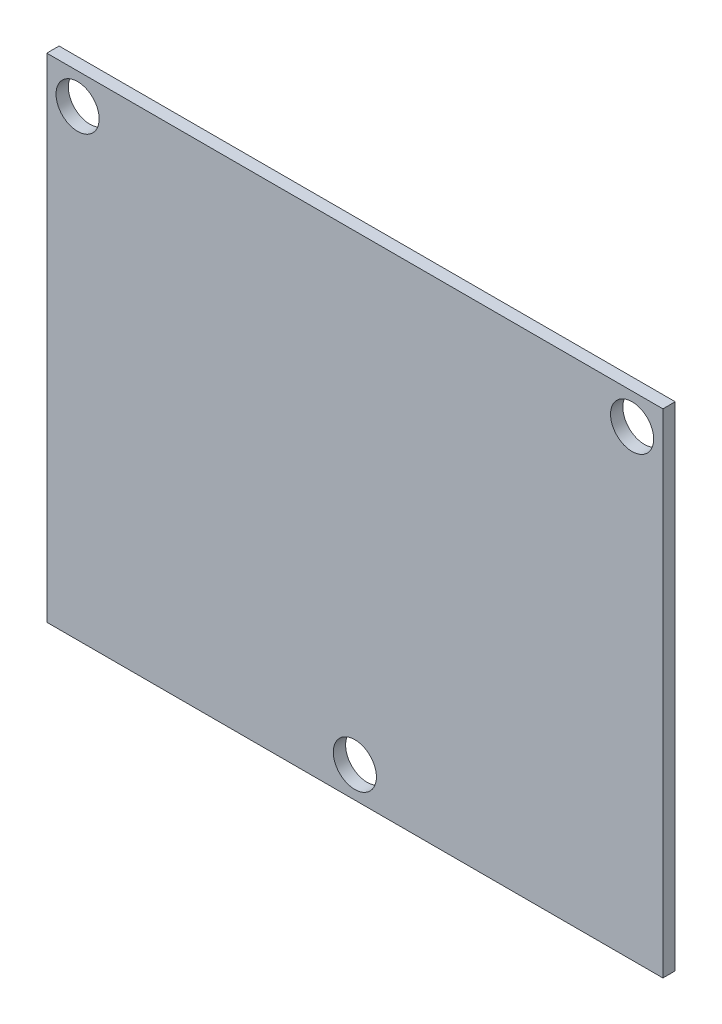
ISO-10303-21;
HEADER;
FILE_DESCRIPTION(('STEP AP214'),'2;1');
FILE_NAME('part.step','',(''),(''),'','','');
FILE_SCHEMA(('AUTOMOTIVE_DESIGN { 1 0 10303 214 1 1 1 1 }'));
ENDSEC;
DATA;
#1=APPLICATION_CONTEXT('core data for automotive mechanical design processes');
#2=APPLICATION_PROTOCOL_DEFINITION('international standard','automotive_design',2000,#1);
#3=PRODUCT_CONTEXT('',#1,'mechanical');
#4=PRODUCT('Part','Part','',(#3));
#5=PRODUCT_RELATED_PRODUCT_CATEGORY('part','',(#4));
#6=PRODUCT_DEFINITION_FORMATION('','',#4);
#7=PRODUCT_DEFINITION_CONTEXT('part definition',#1,'design');
#8=PRODUCT_DEFINITION('design','',#6,#7);
#9=PRODUCT_DEFINITION_SHAPE('','',#8);
#10=(LENGTH_UNIT() NAMED_UNIT(*) SI_UNIT(.MILLI.,.METRE.));
#11=(NAMED_UNIT(*) PLANE_ANGLE_UNIT() SI_UNIT($,.RADIAN.));
#12=(NAMED_UNIT(*) SI_UNIT($,.STERADIAN.) SOLID_ANGLE_UNIT());
#13=UNCERTAINTY_MEASURE_WITH_UNIT(LENGTH_MEASURE(1.E-05),#10,'distance_accuracy_value','');
#14=(GEOMETRIC_REPRESENTATION_CONTEXT(3) GLOBAL_UNCERTAINTY_ASSIGNED_CONTEXT((#13)) GLOBAL_UNIT_ASSIGNED_CONTEXT((#10,
#11,#12)) REPRESENTATION_CONTEXT('',''));
#15=CARTESIAN_POINT('',(0.,0.,0.));
#16=DIRECTION('',(0.,0.,1.));
#17=DIRECTION('',(1.,0.,0.));
#18=AXIS2_PLACEMENT_3D('',#15,#16,#17);
#19=CARTESIAN_POINT('',(0.,0.,5.08));
#20=DIRECTION('',(1.,0.,0.));
#21=DIRECTION('',(0.,0.,-1.));
#22=AXIS2_PLACEMENT_3D('',#19,#20,#21);
#23=PLANE('',#22);
#24=DIRECTION('',(0.,-1.,0.));
#25=VECTOR('',#24,1.);
#26=CARTESIAN_POINT('',(0.,0.,0.));
#27=LINE('',#26,#25);
#28=CARTESIAN_POINT('',(0.,203.2,0.));
#29=VERTEX_POINT('',#28);
#30=CARTESIAN_POINT('',(0.,0.,0.));
#31=VERTEX_POINT('',#30);
#32=EDGE_CURVE('E95',#29,#31,#27,.T.);
#33=ORIENTED_EDGE('',*,*,#32,.T.);
#34=DIRECTION('',(0.,0.,-1.));
#35=VECTOR('',#34,1.);
#36=CARTESIAN_POINT('',(0.,0.,5.08));
#37=LINE('',#36,#35);
#38=CARTESIAN_POINT('',(0.,0.,5.08));
#39=VERTEX_POINT('',#38);
#40=EDGE_CURVE('E11',#39,#31,#37,.T.);
#41=ORIENTED_EDGE('',*,*,#40,.F.);
#42=DIRECTION('',(0.,-1.,0.));
#43=VECTOR('',#42,1.);
#44=CARTESIAN_POINT('',(0.,0.,5.08));
#45=LINE('',#44,#43);
#46=CARTESIAN_POINT('',(0.,203.2,5.08));
#47=VERTEX_POINT('',#46);
#48=EDGE_CURVE('E83',#47,#39,#45,.T.);
#49=ORIENTED_EDGE('',*,*,#48,.F.);
#50=DIRECTION('',(0.,0.,-1.));
#51=VECTOR('',#50,1.);
#52=CARTESIAN_POINT('',(0.,203.2,5.08));
#53=LINE('',#52,#51);
#54=EDGE_CURVE('E91',#47,#29,#53,.T.);
#55=ORIENTED_EDGE('',*,*,#54,.T.);
#56=EDGE_LOOP('',(#33,#41,#49,#55));
#57=FACE_BOUND('',#56,.T.);
#58=ADVANCED_FACE('F32',(#57),#23,.F.);
#59=CARTESIAN_POINT('',(0.,0.,5.08));
#60=DIRECTION('',(0.,1.,0.));
#61=DIRECTION('',(0.,0.,1.));
#62=AXIS2_PLACEMENT_3D('',#59,#60,#61);
#63=PLANE('',#62);
#64=DIRECTION('',(1.,0.,0.));
#65=VECTOR('',#64,1.);
#66=CARTESIAN_POINT('',(0.,0.,0.));
#67=LINE('',#66,#65);
#68=CARTESIAN_POINT('',(254.,0.,0.));
#69=VERTEX_POINT('',#68);
#70=EDGE_CURVE('E87',#31,#69,#67,.T.);
#71=ORIENTED_EDGE('',*,*,#70,.T.);
#72=DIRECTION('',(0.,0.,-1.));
#73=VECTOR('',#72,1.);
#74=CARTESIAN_POINT('',(254.,0.,5.08));
#75=LINE('',#74,#73);
#76=CARTESIAN_POINT('',(254.,0.,5.08));
#77=VERTEX_POINT('',#76);
#78=EDGE_CURVE('E40',#77,#69,#75,.T.);
#79=ORIENTED_EDGE('',*,*,#78,.F.);
#80=DIRECTION('',(1.,0.,0.));
#81=VECTOR('',#80,1.);
#82=CARTESIAN_POINT('',(0.,0.,5.08));
#83=LINE('',#82,#81);
#84=EDGE_CURVE('E78',#39,#77,#83,.T.);
#85=ORIENTED_EDGE('',*,*,#84,.F.);
#86=ORIENTED_EDGE('',*,*,#40,.T.);
#87=EDGE_LOOP('',(#71,#79,#85,#86));
#88=FACE_BOUND('',#87,.T.);
#89=ADVANCED_FACE('F86',(#88),#63,.F.);
#90=CARTESIAN_POINT('',(254.,0.,5.08));
#91=DIRECTION('',(-1.,0.,0.));
#92=DIRECTION('',(0.,0.,1.));
#93=AXIS2_PLACEMENT_3D('',#90,#91,#92);
#94=PLANE('',#93);
#95=DIRECTION('',(0.,1.,0.));
#96=VECTOR('',#95,1.);
#97=CARTESIAN_POINT('',(254.,0.,0.));
#98=LINE('',#97,#96);
#99=CARTESIAN_POINT('',(254.,203.2,0.));
#100=VERTEX_POINT('',#99);
#101=EDGE_CURVE('E65',#69,#100,#98,.T.);
#102=ORIENTED_EDGE('',*,*,#101,.T.);
#103=DIRECTION('',(0.,0.,-1.));
#104=VECTOR('',#103,1.);
#105=CARTESIAN_POINT('',(254.,203.2,5.08));
#106=LINE('',#105,#104);
#107=CARTESIAN_POINT('',(254.,203.2,5.08));
#108=VERTEX_POINT('',#107);
#109=EDGE_CURVE('E88',#108,#100,#106,.T.);
#110=ORIENTED_EDGE('',*,*,#109,.F.);
#111=DIRECTION('',(0.,1.,0.));
#112=VECTOR('',#111,1.);
#113=CARTESIAN_POINT('',(254.,0.,5.08));
#114=LINE('',#113,#112);
#115=EDGE_CURVE('E81',#77,#108,#114,.T.);
#116=ORIENTED_EDGE('',*,*,#115,.F.);
#117=ORIENTED_EDGE('',*,*,#78,.T.);
#118=EDGE_LOOP('',(#102,#110,#116,#117));
#119=FACE_BOUND('',#118,.T.);
#120=ADVANCED_FACE('F89',(#119),#94,.F.);
#121=CARTESIAN_POINT('',(0.,203.2,5.08));
#122=DIRECTION('',(0.,-1.,0.));
#123=DIRECTION('',(0.,0.,-1.));
#124=AXIS2_PLACEMENT_3D('',#121,#122,#123);
#125=PLANE('',#124);
#126=DIRECTION('',(-1.,0.,0.));
#127=VECTOR('',#126,1.);
#128=CARTESIAN_POINT('',(0.,203.2,0.));
#129=LINE('',#128,#127);
#130=EDGE_CURVE('E71',#100,#29,#129,.T.);
#131=ORIENTED_EDGE('',*,*,#130,.T.);
#132=ORIENTED_EDGE('',*,*,#54,.F.);
#133=DIRECTION('',(-1.,0.,0.));
#134=VECTOR('',#133,1.);
#135=CARTESIAN_POINT('',(0.,203.2,5.08));
#136=LINE('',#135,#134);
#137=EDGE_CURVE('E48',#108,#47,#136,.T.);
#138=ORIENTED_EDGE('',*,*,#137,.F.);
#139=ORIENTED_EDGE('',*,*,#109,.T.);
#140=EDGE_LOOP('',(#131,#132,#138,#139));
#141=FACE_BOUND('',#140,.T.);
#142=ADVANCED_FACE('F103',(#141),#125,.F.);
#143=CARTESIAN_POINT('',(0.,0.,5.08));
#144=DIRECTION('',(0.,0.,-1.));
#145=DIRECTION('',(-1.,0.,0.));
#146=AXIS2_PLACEMENT_3D('',#143,#144,#145);
#147=PLANE('',#146);
#148=CARTESIAN_POINT('',(12.7,190.5,5.08));
#149=DIRECTION('',(0.,0.,1.));
#150=DIRECTION('',(1.,0.,0.));
#151=AXIS2_PLACEMENT_3D('',#148,#149,#150);
#152=CIRCLE('',#151,8.89);
#153=CARTESIAN_POINT('',(21.59,190.5,5.08));
#154=VERTEX_POINT('',#153);
#155=EDGE_CURVE('E121',#154,#154,#152,.T.);
#156=ORIENTED_EDGE('',*,*,#155,.F.);
#157=EDGE_LOOP('',(#156));
#158=FACE_BOUND('',#157,.T.);
#159=CARTESIAN_POINT('',(241.3,190.5,5.08));
#160=DIRECTION('',(0.,0.,1.));
#161=DIRECTION('',(1.,0.,0.));
#162=AXIS2_PLACEMENT_3D('',#159,#160,#161);
#163=CIRCLE('',#162,8.89000000000001);
#164=CARTESIAN_POINT('',(250.19,190.5,5.08));
#165=VERTEX_POINT('',#164);
#166=EDGE_CURVE('E115',#165,#165,#163,.T.);
#167=ORIENTED_EDGE('',*,*,#166,.F.);
#168=EDGE_LOOP('',(#167));
#169=FACE_BOUND('',#168,.T.);
#170=CARTESIAN_POINT('',(127.,12.7,5.08));
#171=DIRECTION('',(0.,0.,1.));
#172=DIRECTION('',(1.,0.,0.));
#173=AXIS2_PLACEMENT_3D('',#170,#171,#172);
#174=CIRCLE('',#173,8.89000000000001);
#175=CARTESIAN_POINT('',(135.89,12.7,5.08));
#176=VERTEX_POINT('',#175);
#177=EDGE_CURVE('E109',#176,#176,#174,.T.);
#178=ORIENTED_EDGE('',*,*,#177,.F.);
#179=EDGE_LOOP('',(#178));
#180=FACE_BOUND('',#179,.T.);
#181=ORIENTED_EDGE('',*,*,#48,.T.);
#182=ORIENTED_EDGE('',*,*,#84,.T.);
#183=ORIENTED_EDGE('',*,*,#115,.T.);
#184=ORIENTED_EDGE('',*,*,#137,.T.);
#185=EDGE_LOOP('',(#181,#182,#183,#184));
#186=FACE_BOUND('',#185,.T.);
#187=ADVANCED_FACE('F79',(#158,#169,#180,#186),#147,.F.);
#188=CARTESIAN_POINT('',(0.,0.,0.));
#189=DIRECTION('',(0.,0.,-1.));
#190=DIRECTION('',(-1.,0.,0.));
#191=AXIS2_PLACEMENT_3D('',#188,#189,#190);
#192=PLANE('',#191);
#193=CARTESIAN_POINT('',(12.7,190.5,0.));
#194=DIRECTION('',(0.,0.,1.));
#195=DIRECTION('',(1.,0.,0.));
#196=AXIS2_PLACEMENT_3D('',#193,#194,#195);
#197=CIRCLE('',#196,8.89);
#198=CARTESIAN_POINT('',(21.59,190.5,0.));
#199=VERTEX_POINT('',#198);
#200=EDGE_CURVE('E98',#199,#199,#197,.T.);
#201=ORIENTED_EDGE('',*,*,#200,.T.);
#202=EDGE_LOOP('',(#201));
#203=FACE_BOUND('',#202,.T.);
#204=CARTESIAN_POINT('',(241.3,190.5,0.));
#205=DIRECTION('',(0.,0.,1.));
#206=DIRECTION('',(1.,0.,0.));
#207=AXIS2_PLACEMENT_3D('',#204,#205,#206);
#208=CIRCLE('',#207,8.89000000000001);
#209=CARTESIAN_POINT('',(250.19,190.5,0.));
#210=VERTEX_POINT('',#209);
#211=EDGE_CURVE('E118',#210,#210,#208,.T.);
#212=ORIENTED_EDGE('',*,*,#211,.T.);
#213=EDGE_LOOP('',(#212));
#214=FACE_BOUND('',#213,.T.);
#215=CARTESIAN_POINT('',(127.,12.7,0.));
#216=DIRECTION('',(0.,0.,1.));
#217=DIRECTION('',(1.,0.,0.));
#218=AXIS2_PLACEMENT_3D('',#215,#216,#217);
#219=CIRCLE('',#218,8.89000000000001);
#220=CARTESIAN_POINT('',(135.89,12.7,0.));
#221=VERTEX_POINT('',#220);
#222=EDGE_CURVE('E112',#221,#221,#219,.T.);
#223=ORIENTED_EDGE('',*,*,#222,.T.);
#224=EDGE_LOOP('',(#223));
#225=FACE_BOUND('',#224,.T.);
#226=ORIENTED_EDGE('',*,*,#32,.F.);
#227=ORIENTED_EDGE('',*,*,#130,.F.);
#228=ORIENTED_EDGE('',*,*,#101,.F.);
#229=ORIENTED_EDGE('',*,*,#70,.F.);
#230=EDGE_LOOP('',(#226,#227,#228,#229));
#231=FACE_BOUND('',#230,.T.);
#232=ADVANCED_FACE('F106',(#203,#214,#225,#231),#192,.T.);
#233=CARTESIAN_POINT('',(127.,12.7,0.));
#234=DIRECTION('',(0.,0.,1.));
#235=DIRECTION('',(1.,0.,0.));
#236=AXIS2_PLACEMENT_3D('',#233,#234,#235);
#237=CYLINDRICAL_SURFACE('',#236,8.89000000000001);
#238=ORIENTED_EDGE('',*,*,#222,.F.);
#239=EDGE_LOOP('',(#238));
#240=FACE_BOUND('',#239,.T.);
#241=ORIENTED_EDGE('',*,*,#177,.T.);
#242=EDGE_LOOP('',(#241));
#243=FACE_BOUND('',#242,.T.);
#244=ADVANCED_FACE('F143',(#240,#243),#237,.F.);
#245=CARTESIAN_POINT('',(241.3,190.5,0.));
#246=DIRECTION('',(0.,0.,1.));
#247=DIRECTION('',(1.,0.,0.));
#248=AXIS2_PLACEMENT_3D('',#245,#246,#247);
#249=CYLINDRICAL_SURFACE('',#248,8.89000000000001);
#250=ORIENTED_EDGE('',*,*,#211,.F.);
#251=EDGE_LOOP('',(#250));
#252=FACE_BOUND('',#251,.T.);
#253=ORIENTED_EDGE('',*,*,#166,.T.);
#254=EDGE_LOOP('',(#253));
#255=FACE_BOUND('',#254,.T.);
#256=ADVANCED_FACE('F132',(#252,#255),#249,.F.);
#257=CARTESIAN_POINT('',(12.7,190.5,0.));
#258=DIRECTION('',(0.,0.,1.));
#259=DIRECTION('',(1.,0.,0.));
#260=AXIS2_PLACEMENT_3D('',#257,#258,#259);
#261=CYLINDRICAL_SURFACE('',#260,8.89);
#262=ORIENTED_EDGE('',*,*,#200,.F.);
#263=EDGE_LOOP('',(#262));
#264=FACE_BOUND('',#263,.T.);
#265=ORIENTED_EDGE('',*,*,#155,.T.);
#266=EDGE_LOOP('',(#265));
#267=FACE_BOUND('',#266,.T.);
#268=ADVANCED_FACE('F129',(#264,#267),#261,.F.);
#269=CLOSED_SHELL('',(#58,#89,#120,#142,#187,#232,#244,#256,#268));
#270=MANIFOLD_SOLID_BREP('B2',#269);
#271=ADVANCED_BREP_SHAPE_REPRESENTATION('',(#18,#270),#14);
#272=SHAPE_DEFINITION_REPRESENTATION(#9,#271);
ENDSEC;
END-ISO-10303-21;
